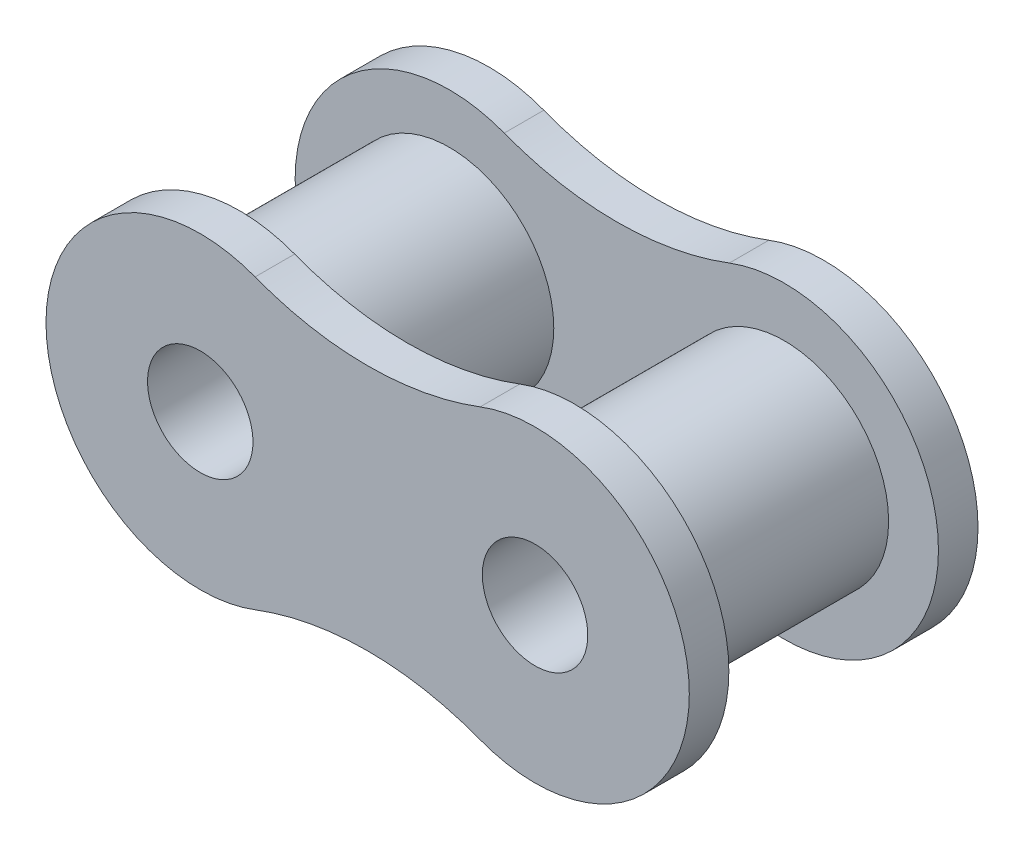
ISO-10303-21;
HEADER;
FILE_DESCRIPTION(('STEP AP214'),'2;1');
FILE_NAME('part.step','',(''),(''),'','','');
FILE_SCHEMA(('AUTOMOTIVE_DESIGN { 1 0 10303 214 1 1 1 1 }'));
ENDSEC;
DATA;
#1=APPLICATION_CONTEXT('core data for automotive mechanical design processes');
#2=APPLICATION_PROTOCOL_DEFINITION('international standard','automotive_design',2000,#1);
#3=PRODUCT_CONTEXT('',#1,'mechanical');
#4=PRODUCT('Part','Part','',(#3));
#5=PRODUCT_RELATED_PRODUCT_CATEGORY('part','',(#4));
#6=PRODUCT_DEFINITION_FORMATION('','',#4);
#7=PRODUCT_DEFINITION_CONTEXT('part definition',#1,'design');
#8=PRODUCT_DEFINITION('design','',#6,#7);
#9=PRODUCT_DEFINITION_SHAPE('','',#8);
#10=(LENGTH_UNIT() NAMED_UNIT(*) SI_UNIT(.MILLI.,.METRE.));
#11=(NAMED_UNIT(*) PLANE_ANGLE_UNIT() SI_UNIT($,.RADIAN.));
#12=(NAMED_UNIT(*) SI_UNIT($,.STERADIAN.) SOLID_ANGLE_UNIT());
#13=UNCERTAINTY_MEASURE_WITH_UNIT(LENGTH_MEASURE(1.E-05),#10,'distance_accuracy_value','');
#14=(GEOMETRIC_REPRESENTATION_CONTEXT(3) GLOBAL_UNCERTAINTY_ASSIGNED_CONTEXT((#13)) GLOBAL_UNIT_ASSIGNED_CONTEXT((#10,
#11,#12)) REPRESENTATION_CONTEXT('',''));
#15=CARTESIAN_POINT('',(0.,0.,0.));
#16=DIRECTION('',(0.,0.,1.));
#17=DIRECTION('',(1.,0.,0.));
#18=AXIS2_PLACEMENT_3D('',#15,#16,#17);
#19=CARTESIAN_POINT('',(6.35,16.6823259769134,1.5));
#20=DIRECTION('',(0.,0.,-1.));
#21=DIRECTION('',(-1.,0.,0.));
#22=AXIS2_PLACEMENT_3D('',#19,#20,#21);
#23=CYLINDRICAL_SURFACE('',#22,12.);
#24=CARTESIAN_POINT('',(6.35,16.6823259769134,0.));
#25=DIRECTION('',(0.,0.,-1.));
#26=DIRECTION('',(1.,0.,0.));
#27=AXIS2_PLACEMENT_3D('',#24,#25,#26);
#28=CIRCLE('',#27,12.);
#29=CARTESIAN_POINT('',(10.6189075630252,5.46731691680355,0.));
#30=VERTEX_POINT('',#29);
#31=CARTESIAN_POINT('',(2.08109243697479,5.46731691680355,0.));
#32=VERTEX_POINT('',#31);
#33=EDGE_CURVE('E158',#30,#32,#28,.T.);
#34=ORIENTED_EDGE('',*,*,#33,.T.);
#35=DIRECTION('',(0.,0.,-1.));
#36=VECTOR('',#35,1.);
#37=CARTESIAN_POINT('',(2.08109243697479,5.46731691680355,1.5));
#38=LINE('',#37,#36);
#39=CARTESIAN_POINT('',(2.08109243697479,5.46731691680355,1.5));
#40=VERTEX_POINT('',#39);
#41=EDGE_CURVE('E11',#40,#32,#38,.T.);
#42=ORIENTED_EDGE('',*,*,#41,.F.);
#43=CARTESIAN_POINT('',(6.35,16.6823259769134,1.5));
#44=DIRECTION('',(0.,0.,-1.));
#45=DIRECTION('',(1.,0.,0.));
#46=AXIS2_PLACEMENT_3D('',#43,#44,#45);
#47=CIRCLE('',#46,12.);
#48=CARTESIAN_POINT('',(10.6189075630252,5.46731691680355,1.5));
#49=VERTEX_POINT('',#48);
#50=EDGE_CURVE('E159',#49,#40,#47,.T.);
#51=ORIENTED_EDGE('',*,*,#50,.F.);
#52=DIRECTION('',(0.,0.,-1.));
#53=VECTOR('',#52,1.);
#54=CARTESIAN_POINT('',(10.6189075630252,5.46731691680355,1.5));
#55=LINE('',#54,#53);
#56=EDGE_CURVE('E165',#49,#30,#55,.T.);
#57=ORIENTED_EDGE('',*,*,#56,.T.);
#58=EDGE_LOOP('',(#34,#42,#51,#57));
#59=FACE_BOUND('',#58,.T.);
#60=ADVANCED_FACE('F32',(#59),#23,.F.);
#61=CARTESIAN_POINT('',(0.,0.,1.5));
#62=DIRECTION('',(0.,0.,-1.));
#63=DIRECTION('',(-1.,0.,0.));
#64=AXIS2_PLACEMENT_3D('',#61,#62,#63);
#65=CYLINDRICAL_SURFACE('',#64,5.85);
#66=CARTESIAN_POINT('',(0.,0.,0.));
#67=DIRECTION('',(0.,0.,1.));
#68=DIRECTION('',(1.,0.,0.));
#69=AXIS2_PLACEMENT_3D('',#66,#67,#68);
#70=CIRCLE('',#69,5.85);
#71=CARTESIAN_POINT('',(2.08109243697479,-5.46731691680355,0.));
#72=VERTEX_POINT('',#71);
#73=EDGE_CURVE('E168',#32,#72,#70,.T.);
#74=ORIENTED_EDGE('',*,*,#73,.T.);
#75=DIRECTION('',(0.,0.,-1.));
#76=VECTOR('',#75,1.);
#77=CARTESIAN_POINT('',(2.08109243697479,-5.46731691680355,1.5));
#78=LINE('',#77,#76);
#79=CARTESIAN_POINT('',(2.08109243697479,-5.46731691680355,1.5));
#80=VERTEX_POINT('',#79);
#81=EDGE_CURVE('E40',#80,#72,#78,.T.);
#82=ORIENTED_EDGE('',*,*,#81,.F.);
#83=CARTESIAN_POINT('',(0.,0.,1.5));
#84=DIRECTION('',(0.,0.,1.));
#85=DIRECTION('',(1.,0.,0.));
#86=AXIS2_PLACEMENT_3D('',#83,#84,#85);
#87=CIRCLE('',#86,5.85);
#88=EDGE_CURVE('E79',#40,#80,#87,.T.);
#89=ORIENTED_EDGE('',*,*,#88,.F.);
#90=ORIENTED_EDGE('',*,*,#41,.T.);
#91=EDGE_LOOP('',(#74,#82,#89,#90));
#92=FACE_BOUND('',#91,.T.);
#93=ADVANCED_FACE('F192',(#92),#65,.T.);
#94=CARTESIAN_POINT('',(6.35,-16.6823259769134,1.5));
#95=DIRECTION('',(0.,0.,-1.));
#96=DIRECTION('',(-1.,0.,0.));
#97=AXIS2_PLACEMENT_3D('',#94,#95,#96);
#98=CYLINDRICAL_SURFACE('',#97,12.);
#99=CARTESIAN_POINT('',(6.35,-16.6823259769134,0.));
#100=DIRECTION('',(0.,0.,-1.));
#101=DIRECTION('',(-1.,0.,0.));
#102=AXIS2_PLACEMENT_3D('',#99,#100,#101);
#103=CIRCLE('',#102,12.);
#104=CARTESIAN_POINT('',(10.6189075630252,-5.46731691680355,0.));
#105=VERTEX_POINT('',#104);
#106=EDGE_CURVE('E66',#72,#105,#103,.T.);
#107=ORIENTED_EDGE('',*,*,#106,.T.);
#108=DIRECTION('',(0.,0.,-1.));
#109=VECTOR('',#108,1.);
#110=CARTESIAN_POINT('',(10.6189075630252,-5.46731691680355,1.5));
#111=LINE('',#110,#109);
#112=CARTESIAN_POINT('',(10.6189075630252,-5.46731691680355,1.5));
#113=VERTEX_POINT('',#112);
#114=EDGE_CURVE('E173',#113,#105,#111,.T.);
#115=ORIENTED_EDGE('',*,*,#114,.F.);
#116=CARTESIAN_POINT('',(6.35,-16.6823259769134,1.5));
#117=DIRECTION('',(0.,0.,-1.));
#118=DIRECTION('',(-1.,0.,0.));
#119=AXIS2_PLACEMENT_3D('',#116,#117,#118);
#120=CIRCLE('',#119,12.);
#121=EDGE_CURVE('E162',#80,#113,#120,.T.);
#122=ORIENTED_EDGE('',*,*,#121,.F.);
#123=ORIENTED_EDGE('',*,*,#81,.T.);
#124=EDGE_LOOP('',(#107,#115,#122,#123));
#125=FACE_BOUND('',#124,.T.);
#126=ADVANCED_FACE('F175',(#125),#98,.F.);
#127=CARTESIAN_POINT('',(12.7,0.,1.5));
#128=DIRECTION('',(0.,0.,-1.));
#129=DIRECTION('',(-1.,0.,0.));
#130=AXIS2_PLACEMENT_3D('',#127,#128,#129);
#131=CYLINDRICAL_SURFACE('',#130,5.85);
#132=CARTESIAN_POINT('',(12.7,0.,0.));
#133=DIRECTION('',(0.,0.,1.));
#134=DIRECTION('',(1.,0.,0.));
#135=AXIS2_PLACEMENT_3D('',#132,#133,#134);
#136=CIRCLE('',#135,5.85);
#137=EDGE_CURVE('E72',#105,#30,#136,.T.);
#138=ORIENTED_EDGE('',*,*,#137,.T.);
#139=ORIENTED_EDGE('',*,*,#56,.F.);
#140=CARTESIAN_POINT('',(12.7,0.,1.5));
#141=DIRECTION('',(0.,0.,1.));
#142=DIRECTION('',(1.,0.,0.));
#143=AXIS2_PLACEMENT_3D('',#140,#141,#142);
#144=CIRCLE('',#143,5.85);
#145=EDGE_CURVE('E48',#113,#49,#144,.T.);
#146=ORIENTED_EDGE('',*,*,#145,.F.);
#147=ORIENTED_EDGE('',*,*,#114,.T.);
#148=EDGE_LOOP('',(#138,#139,#146,#147));
#149=FACE_BOUND('',#148,.T.);
#150=ADVANCED_FACE('F182',(#149),#131,.T.);
#151=CARTESIAN_POINT('',(9.525,8.3411629884567,1.5));
#152=DIRECTION('',(0.,0.,1.));
#153=DIRECTION('',(1.,0.,0.));
#154=AXIS2_PLACEMENT_3D('',#151,#152,#153);
#155=PLANE('',#154);
#156=CARTESIAN_POINT('',(12.7,0.,1.5));
#157=DIRECTION('',(0.,0.,1.));
#158=DIRECTION('',(1.,0.,0.));
#159=AXIS2_PLACEMENT_3D('',#156,#157,#158);
#160=CIRCLE('',#159,3.96);
#161=CARTESIAN_POINT('',(8.74,0.,1.5));
#162=VERTEX_POINT('',#161);
#163=EDGE_CURVE('E336',#162,#162,#160,.T.);
#164=ORIENTED_EDGE('',*,*,#163,.F.);
#165=EDGE_LOOP('',(#164));
#166=FACE_BOUND('',#165,.T.);
#167=CARTESIAN_POINT('',(0.,0.,1.5));
#168=DIRECTION('',(0.,0.,1.));
#169=DIRECTION('',(1.,0.,0.));
#170=AXIS2_PLACEMENT_3D('',#167,#168,#169);
#171=CIRCLE('',#170,3.96);
#172=CARTESIAN_POINT('',(-3.96,0.,1.5));
#173=VERTEX_POINT('',#172);
#174=EDGE_CURVE('E155',#173,#173,#171,.T.);
#175=ORIENTED_EDGE('',*,*,#174,.F.);
#176=EDGE_LOOP('',(#175));
#177=FACE_BOUND('',#176,.T.);
#178=ORIENTED_EDGE('',*,*,#50,.T.);
#179=ORIENTED_EDGE('',*,*,#88,.T.);
#180=ORIENTED_EDGE('',*,*,#121,.T.);
#181=ORIENTED_EDGE('',*,*,#145,.T.);
#182=EDGE_LOOP('',(#178,#179,#180,#181));
#183=FACE_BOUND('',#182,.T.);
#184=ADVANCED_FACE('F184',(#166,#177,#183),#155,.T.);
#185=CARTESIAN_POINT('',(9.525,8.3411629884567,0.));
#186=DIRECTION('',(0.,0.,1.));
#187=DIRECTION('',(1.,0.,0.));
#188=AXIS2_PLACEMENT_3D('',#185,#186,#187);
#189=PLANE('',#188);
#190=CARTESIAN_POINT('',(12.7,0.,0.));
#191=DIRECTION('',(0.,0.,-1.));
#192=DIRECTION('',(-1.,0.,0.));
#193=AXIS2_PLACEMENT_3D('',#190,#191,#192);
#194=CIRCLE('',#193,2.);
#195=CARTESIAN_POINT('',(10.7,0.,0.));
#196=VERTEX_POINT('',#195);
#197=EDGE_CURVE('E328',#196,#196,#194,.T.);
#198=ORIENTED_EDGE('',*,*,#197,.F.);
#199=EDGE_LOOP('',(#198));
#200=FACE_BOUND('',#199,.T.);
#201=CARTESIAN_POINT('',(0.,0.,0.));
#202=DIRECTION('',(0.,0.,-1.));
#203=DIRECTION('',(-1.,0.,0.));
#204=AXIS2_PLACEMENT_3D('',#201,#202,#203);
#205=CIRCLE('',#204,2.);
#206=CARTESIAN_POINT('',(-2.,0.,0.));
#207=VERTEX_POINT('',#206);
#208=EDGE_CURVE('E330',#207,#207,#205,.T.);
#209=ORIENTED_EDGE('',*,*,#208,.F.);
#210=EDGE_LOOP('',(#209));
#211=FACE_BOUND('',#210,.T.);
#212=ORIENTED_EDGE('',*,*,#33,.F.);
#213=ORIENTED_EDGE('',*,*,#137,.F.);
#214=ORIENTED_EDGE('',*,*,#106,.F.);
#215=ORIENTED_EDGE('',*,*,#73,.F.);
#216=EDGE_LOOP('',(#212,#213,#214,#215));
#217=FACE_BOUND('',#216,.T.);
#218=ADVANCED_FACE('F178',(#200,#211,#217),#189,.F.);
#219=CARTESIAN_POINT('',(0.,0.,20.6505714139949));
#220=DIRECTION('',(0.,0.,-1.));
#221=DIRECTION('',(-1.,0.,0.));
#222=AXIS2_PLACEMENT_3D('',#219,#220,#221);
#223=CYLINDRICAL_SURFACE('',#222,3.96);
#224=CARTESIAN_POINT('',(0.,0.,9.45));
#225=DIRECTION('',(0.,0.,-1.));
#226=DIRECTION('',(-1.,0.,0.));
#227=AXIS2_PLACEMENT_3D('',#224,#225,#226);
#228=CIRCLE('',#227,3.96);
#229=CARTESIAN_POINT('',(-3.96,0.,9.45));
#230=VERTEX_POINT('',#229);
#231=EDGE_CURVE('E126',#230,#230,#228,.T.);
#232=CARTESIAN_POINT('',(-3.96,0.,9.45));
#233=CARTESIAN_POINT('',(-3.96,0.,9.3671875));
#234=CARTESIAN_POINT('',(-3.96,0.,9.284375));
#235=CARTESIAN_POINT('',(-3.96,0.,9.11875));
#236=CARTESIAN_POINT('',(-3.96,0.,9.0359375));
#237=CARTESIAN_POINT('',(-3.96,0.,8.8703125));
#238=CARTESIAN_POINT('',(-3.96,0.,8.7875));
#239=CARTESIAN_POINT('',(-3.96,0.,8.621875));
#240=CARTESIAN_POINT('',(-3.96,0.,8.5390625));
#241=CARTESIAN_POINT('',(-3.96,0.,8.3734375));
#242=CARTESIAN_POINT('',(-3.96,0.,8.290625));
#243=CARTESIAN_POINT('',(-3.96,0.,8.125));
#244=CARTESIAN_POINT('',(-3.96,0.,8.0421875));
#245=CARTESIAN_POINT('',(-3.96,0.,7.8765625));
#246=CARTESIAN_POINT('',(-3.96,0.,7.79375));
#247=CARTESIAN_POINT('',(-3.96,0.,7.628125));
#248=CARTESIAN_POINT('',(-3.96,0.,7.5453125));
#249=CARTESIAN_POINT('',(-3.96,0.,7.3796875));
#250=CARTESIAN_POINT('',(-3.96,0.,7.296875));
#251=CARTESIAN_POINT('',(-3.96,0.,7.13125));
#252=CARTESIAN_POINT('',(-3.96,0.,7.0484375));
#253=CARTESIAN_POINT('',(-3.96,0.,6.8828125));
#254=CARTESIAN_POINT('',(-3.96,0.,6.8));
#255=CARTESIAN_POINT('',(-3.96,0.,6.634375));
#256=CARTESIAN_POINT('',(-3.96,0.,6.5515625));
#257=CARTESIAN_POINT('',(-3.96,0.,6.3859375));
#258=CARTESIAN_POINT('',(-3.96,0.,6.303125));
#259=CARTESIAN_POINT('',(-3.96,0.,6.1375));
#260=CARTESIAN_POINT('',(-3.96,0.,6.0546875));
#261=CARTESIAN_POINT('',(-3.96,0.,5.8890625));
#262=CARTESIAN_POINT('',(-3.96,0.,5.80625));
#263=CARTESIAN_POINT('',(-3.96,0.,5.640625));
#264=CARTESIAN_POINT('',(-3.96,0.,5.5578125));
#265=CARTESIAN_POINT('',(-3.96,0.,5.3921875));
#266=CARTESIAN_POINT('',(-3.96,0.,5.309375));
#267=CARTESIAN_POINT('',(-3.96,0.,5.14375));
#268=CARTESIAN_POINT('',(-3.96,0.,5.0609375));
#269=CARTESIAN_POINT('',(-3.96,0.,4.8953125));
#270=CARTESIAN_POINT('',(-3.96,0.,4.8125));
#271=CARTESIAN_POINT('',(-3.96,0.,4.646875));
#272=CARTESIAN_POINT('',(-3.96,0.,4.5640625));
#273=CARTESIAN_POINT('',(-3.96,0.,4.3984375));
#274=CARTESIAN_POINT('',(-3.96,0.,4.315625));
#275=CARTESIAN_POINT('',(-3.96,0.,4.15));
#276=CARTESIAN_POINT('',(-3.96,0.,4.0671875));
#277=CARTESIAN_POINT('',(-3.96,0.,3.9015625));
#278=CARTESIAN_POINT('',(-3.96,0.,3.81875));
#279=CARTESIAN_POINT('',(-3.96,0.,3.653125));
#280=CARTESIAN_POINT('',(-3.96,0.,3.5703125));
#281=CARTESIAN_POINT('',(-3.96,0.,3.4046875));
#282=CARTESIAN_POINT('',(-3.96,0.,3.321875));
#283=CARTESIAN_POINT('',(-3.96,0.,3.15625));
#284=CARTESIAN_POINT('',(-3.96,0.,3.0734375));
#285=CARTESIAN_POINT('',(-3.96,0.,2.9078125));
#286=CARTESIAN_POINT('',(-3.96,0.,2.825));
#287=CARTESIAN_POINT('',(-3.96,0.,2.659375));
#288=CARTESIAN_POINT('',(-3.96,0.,2.5765625));
#289=CARTESIAN_POINT('',(-3.96,0.,2.4109375));
#290=CARTESIAN_POINT('',(-3.96,0.,2.328125));
#291=CARTESIAN_POINT('',(-3.96,0.,2.1625));
#292=CARTESIAN_POINT('',(-3.96,0.,2.0796875));
#293=CARTESIAN_POINT('',(-3.96,0.,1.9140625));
#294=CARTESIAN_POINT('',(-3.96,0.,1.83125));
#295=CARTESIAN_POINT('',(-3.96,0.,1.665625));
#296=CARTESIAN_POINT('',(-3.96,0.,1.5828125));
#297=CARTESIAN_POINT('',(-3.96,0.,1.5));
#298=B_SPLINE_CURVE_WITH_KNOTS('',3,(#232,#233,#234,#235,#236,#237,#238,#239,#240,#241,#242,
#243,#244,#245,#246,#247,#248,#249,#250,#251,#252,#253,#254,#255,#256,#257,#258,#259,#260,#261,
#262,#263,#264,#265,#266,#267,#268,#269,#270,#271,#272,#273,#274,#275,#276,#277,#278,#279,#280,
#281,#282,#283,#284,#285,#286,#287,#288,#289,#290,#291,#292,#293,#294,#295,#296,#297),
.UNSPECIFIED.,.F.,.F.,(4,2,2,2,2,2,2,2,2,2,2,2,2,2,2,2,2,2,2,2,2,2,2,2,2,2,2,2,2,2,2,2,4),(0.,
0.2484375,0.496875000000001,0.745312499999999,0.99375,1.2421875,1.490625,1.7390625,1.9875,
2.2359375,2.484375,2.7328125,2.98125,3.2296875,3.478125,3.7265625,3.975,4.2234375,4.471875,
4.7203125,4.96875,5.2171875,5.465625,5.7140625,5.9625,6.2109375,6.459375,6.7078125,6.95625,
7.2046875,7.453125,7.7015625,7.95),.UNSPECIFIED.);
#299=EDGE_CURVE('BSEAM222',#230,#173,#298,.T.);
#300=ORIENTED_EDGE('',*,*,#231,.T.);
#301=ORIENTED_EDGE('',*,*,#174,.T.);
#302=ORIENTED_EDGE('',*,*,#299,.T.);
#303=ORIENTED_EDGE('',*,*,#299,.F.);
#304=EDGE_LOOP('',(#300,#302,#301,#303));
#305=FACE_BOUND('',#304,.T.);
#306=ADVANCED_FACE('F222',(#305),#223,.T.);
#307=CARTESIAN_POINT('',(6.35,16.6823259769134,9.45));
#308=DIRECTION('',(0.,0.,1.));
#309=DIRECTION('',(-1.,0.,0.));
#310=AXIS2_PLACEMENT_3D('',#307,#308,#309);
#311=CYLINDRICAL_SURFACE('',#310,12.);
#312=CARTESIAN_POINT('',(6.35,16.6823259769134,10.95));
#313=DIRECTION('',(0.,0.,-1.));
#314=DIRECTION('',(1.,0.,0.));
#315=AXIS2_PLACEMENT_3D('',#312,#313,#314);
#316=CIRCLE('',#315,12.);
#317=CARTESIAN_POINT('',(10.6189075630252,5.46731691680355,10.95));
#318=VERTEX_POINT('',#317);
#319=CARTESIAN_POINT('',(2.08109243697479,5.46731691680355,10.95));
#320=VERTEX_POINT('',#319);
#321=EDGE_CURVE('E143',#318,#320,#316,.T.);
#322=ORIENTED_EDGE('',*,*,#321,.F.);
#323=DIRECTION('',(0.,0.,1.));
#324=VECTOR('',#323,1.);
#325=CARTESIAN_POINT('',(10.6189075630252,5.46731691680355,9.45));
#326=LINE('',#325,#324);
#327=CARTESIAN_POINT('',(10.6189075630252,5.46731691680355,9.45));
#328=VERTEX_POINT('',#327);
#329=EDGE_CURVE('E131',#328,#318,#326,.T.);
#330=ORIENTED_EDGE('',*,*,#329,.F.);
#331=CARTESIAN_POINT('',(6.35,16.6823259769134,9.45));
#332=DIRECTION('',(0.,0.,-1.));
#333=DIRECTION('',(1.,0.,0.));
#334=AXIS2_PLACEMENT_3D('',#331,#332,#333);
#335=CIRCLE('',#334,12.);
#336=CARTESIAN_POINT('',(2.08109243697479,5.46731691680355,9.45));
#337=VERTEX_POINT('',#336);
#338=EDGE_CURVE('E110',#328,#337,#335,.T.);
#339=ORIENTED_EDGE('',*,*,#338,.T.);
#340=DIRECTION('',(0.,0.,1.));
#341=VECTOR('',#340,1.);
#342=CARTESIAN_POINT('',(2.08109243697479,5.46731691680355,9.45));
#343=LINE('',#342,#341);
#344=EDGE_CURVE('E119',#337,#320,#343,.T.);
#345=ORIENTED_EDGE('',*,*,#344,.T.);
#346=EDGE_LOOP('',(#322,#330,#339,#345));
#347=FACE_BOUND('',#346,.T.);
#348=ADVANCED_FACE('F129',(#347),#311,.F.);
#349=CARTESIAN_POINT('',(0.,0.,9.45));
#350=DIRECTION('',(0.,0.,1.));
#351=DIRECTION('',(-1.,0.,0.));
#352=AXIS2_PLACEMENT_3D('',#349,#350,#351);
#353=CYLINDRICAL_SURFACE('',#352,5.85);
#354=CARTESIAN_POINT('',(0.,0.,10.95));
#355=DIRECTION('',(0.,0.,1.));
#356=DIRECTION('',(1.,0.,0.));
#357=AXIS2_PLACEMENT_3D('',#354,#355,#356);
#358=CIRCLE('',#357,5.85);
#359=CARTESIAN_POINT('',(2.08109243697479,-5.46731691680355,10.95));
#360=VERTEX_POINT('',#359);
#361=EDGE_CURVE('E122',#320,#360,#358,.T.);
#362=ORIENTED_EDGE('',*,*,#361,.F.);
#363=ORIENTED_EDGE('',*,*,#344,.F.);
#364=CARTESIAN_POINT('',(0.,0.,9.45));
#365=DIRECTION('',(0.,0.,1.));
#366=DIRECTION('',(1.,0.,0.));
#367=AXIS2_PLACEMENT_3D('',#364,#365,#366);
#368=CIRCLE('',#367,5.85);
#369=CARTESIAN_POINT('',(2.08109243697479,-5.46731691680355,9.45));
#370=VERTEX_POINT('',#369);
#371=EDGE_CURVE('E106',#337,#370,#368,.T.);
#372=ORIENTED_EDGE('',*,*,#371,.T.);
#373=DIRECTION('',(0.,0.,1.));
#374=VECTOR('',#373,1.);
#375=CARTESIAN_POINT('',(2.08109243697479,-5.46731691680355,9.45));
#376=LINE('',#375,#374);
#377=EDGE_CURVE('E127',#370,#360,#376,.T.);
#378=ORIENTED_EDGE('',*,*,#377,.T.);
#379=EDGE_LOOP('',(#362,#363,#372,#378));
#380=FACE_BOUND('',#379,.T.);
#381=ADVANCED_FACE('F120',(#380),#353,.T.);
#382=CARTESIAN_POINT('',(6.35,-16.6823259769134,9.45));
#383=DIRECTION('',(0.,0.,1.));
#384=DIRECTION('',(-1.,0.,0.));
#385=AXIS2_PLACEMENT_3D('',#382,#383,#384);
#386=CYLINDRICAL_SURFACE('',#385,12.);
#387=CARTESIAN_POINT('',(6.35,-16.6823259769134,10.95));
#388=DIRECTION('',(0.,0.,-1.));
#389=DIRECTION('',(-1.,0.,0.));
#390=AXIS2_PLACEMENT_3D('',#387,#388,#389);
#391=CIRCLE('',#390,12.);
#392=CARTESIAN_POINT('',(10.6189075630252,-5.46731691680355,10.95));
#393=VERTEX_POINT('',#392);
#394=EDGE_CURVE('E134',#360,#393,#391,.T.);
#395=ORIENTED_EDGE('',*,*,#394,.F.);
#396=ORIENTED_EDGE('',*,*,#377,.F.);
#397=CARTESIAN_POINT('',(6.35,-16.6823259769134,9.45));
#398=DIRECTION('',(0.,0.,-1.));
#399=DIRECTION('',(-1.,0.,0.));
#400=AXIS2_PLACEMENT_3D('',#397,#398,#399);
#401=CIRCLE('',#400,12.);
#402=CARTESIAN_POINT('',(10.6189075630252,-5.46731691680355,9.45));
#403=VERTEX_POINT('',#402);
#404=EDGE_CURVE('E113',#370,#403,#401,.T.);
#405=ORIENTED_EDGE('',*,*,#404,.T.);
#406=DIRECTION('',(0.,0.,1.));
#407=VECTOR('',#406,1.);
#408=CARTESIAN_POINT('',(10.6189075630252,-5.46731691680355,9.45));
#409=LINE('',#408,#407);
#410=EDGE_CURVE('E149',#403,#393,#409,.T.);
#411=ORIENTED_EDGE('',*,*,#410,.T.);
#412=EDGE_LOOP('',(#395,#396,#405,#411));
#413=FACE_BOUND('',#412,.T.);
#414=ADVANCED_FACE('F246',(#413),#386,.F.);
#415=CARTESIAN_POINT('',(12.7,0.,9.45));
#416=DIRECTION('',(0.,0.,1.));
#417=DIRECTION('',(-1.,0.,0.));
#418=AXIS2_PLACEMENT_3D('',#415,#416,#417);
#419=CYLINDRICAL_SURFACE('',#418,5.85);
#420=CARTESIAN_POINT('',(12.7,0.,10.95));
#421=DIRECTION('',(0.,0.,1.));
#422=DIRECTION('',(1.,0.,0.));
#423=AXIS2_PLACEMENT_3D('',#420,#421,#422);
#424=CIRCLE('',#423,5.85);
#425=EDGE_CURVE('E132',#393,#318,#424,.T.);
#426=ORIENTED_EDGE('',*,*,#425,.F.);
#427=ORIENTED_EDGE('',*,*,#410,.F.);
#428=CARTESIAN_POINT('',(12.7,0.,9.45));
#429=DIRECTION('',(0.,0.,1.));
#430=DIRECTION('',(1.,0.,0.));
#431=AXIS2_PLACEMENT_3D('',#428,#429,#430);
#432=CIRCLE('',#431,5.85);
#433=EDGE_CURVE('E141',#403,#328,#432,.T.);
#434=ORIENTED_EDGE('',*,*,#433,.T.);
#435=ORIENTED_EDGE('',*,*,#329,.T.);
#436=EDGE_LOOP('',(#426,#427,#434,#435));
#437=FACE_BOUND('',#436,.T.);
#438=ADVANCED_FACE('F255',(#437),#419,.T.);
#439=CARTESIAN_POINT('',(9.525,8.3411629884567,9.45));
#440=DIRECTION('',(0.,0.,-1.));
#441=DIRECTION('',(1.,0.,0.));
#442=AXIS2_PLACEMENT_3D('',#439,#440,#441);
#443=PLANE('',#442);
#444=CARTESIAN_POINT('',(12.7,0.,9.45));
#445=DIRECTION('',(0.,0.,-1.));
#446=DIRECTION('',(-1.,0.,0.));
#447=AXIS2_PLACEMENT_3D('',#444,#445,#446);
#448=CIRCLE('',#447,3.96);
#449=CARTESIAN_POINT('',(8.74,0.,9.45));
#450=VERTEX_POINT('',#449);
#451=EDGE_CURVE('E137',#450,#450,#448,.T.);
#452=ORIENTED_EDGE('',*,*,#451,.F.);
#453=EDGE_LOOP('',(#452));
#454=FACE_BOUND('',#453,.T.);
#455=ORIENTED_EDGE('',*,*,#231,.F.);
#456=EDGE_LOOP('',(#455));
#457=FACE_BOUND('',#456,.T.);
#458=ORIENTED_EDGE('',*,*,#338,.F.);
#459=ORIENTED_EDGE('',*,*,#433,.F.);
#460=ORIENTED_EDGE('',*,*,#404,.F.);
#461=ORIENTED_EDGE('',*,*,#371,.F.);
#462=EDGE_LOOP('',(#458,#459,#460,#461));
#463=FACE_BOUND('',#462,.T.);
#464=ADVANCED_FACE('F108',(#454,#457,#463),#443,.T.);
#465=CARTESIAN_POINT('',(9.525,8.3411629884567,10.95));
#466=DIRECTION('',(0.,0.,-1.));
#467=DIRECTION('',(1.,0.,0.));
#468=AXIS2_PLACEMENT_3D('',#465,#466,#467);
#469=PLANE('',#468);
#470=CARTESIAN_POINT('',(12.7,0.,10.95));
#471=DIRECTION('',(0.,0.,-1.));
#472=DIRECTION('',(-1.,0.,0.));
#473=AXIS2_PLACEMENT_3D('',#470,#471,#472);
#474=CIRCLE('',#473,2.);
#475=CARTESIAN_POINT('',(10.7,0.,10.95));
#476=VERTEX_POINT('',#475);
#477=EDGE_CURVE('E325',#476,#476,#474,.T.);
#478=ORIENTED_EDGE('',*,*,#477,.T.);
#479=EDGE_LOOP('',(#478));
#480=FACE_BOUND('',#479,.T.);
#481=CARTESIAN_POINT('',(0.,0.,10.95));
#482=DIRECTION('',(0.,0.,-1.));
#483=DIRECTION('',(-1.,0.,0.));
#484=AXIS2_PLACEMENT_3D('',#481,#482,#483);
#485=CIRCLE('',#484,2.);
#486=CARTESIAN_POINT('',(-2.,0.,10.95));
#487=VERTEX_POINT('',#486);
#488=EDGE_CURVE('E333',#487,#487,#485,.T.);
#489=ORIENTED_EDGE('',*,*,#488,.T.);
#490=EDGE_LOOP('',(#489));
#491=FACE_BOUND('',#490,.T.);
#492=ORIENTED_EDGE('',*,*,#321,.T.);
#493=ORIENTED_EDGE('',*,*,#361,.T.);
#494=ORIENTED_EDGE('',*,*,#394,.T.);
#495=ORIENTED_EDGE('',*,*,#425,.T.);
#496=EDGE_LOOP('',(#492,#493,#494,#495));
#497=FACE_BOUND('',#496,.T.);
#498=ADVANCED_FACE('F274',(#480,#491,#497),#469,.F.);
#499=CARTESIAN_POINT('',(12.7,0.,20.6505714139949));
#500=DIRECTION('',(0.,0.,-1.));
#501=DIRECTION('',(-1.,0.,0.));
#502=AXIS2_PLACEMENT_3D('',#499,#500,#501);
#503=CYLINDRICAL_SURFACE('',#502,3.96);
#504=CARTESIAN_POINT('',(8.74,0.,9.45));
#505=CARTESIAN_POINT('',(8.74,0.,9.3671875));
#506=CARTESIAN_POINT('',(8.74,0.,9.284375));
#507=CARTESIAN_POINT('',(8.74,0.,9.11875));
#508=CARTESIAN_POINT('',(8.74,0.,9.0359375));
#509=CARTESIAN_POINT('',(8.74,0.,8.8703125));
#510=CARTESIAN_POINT('',(8.74,0.,8.7875));
#511=CARTESIAN_POINT('',(8.74,0.,8.621875));
#512=CARTESIAN_POINT('',(8.74,0.,8.5390625));
#513=CARTESIAN_POINT('',(8.74,0.,8.3734375));
#514=CARTESIAN_POINT('',(8.74,0.,8.290625));
#515=CARTESIAN_POINT('',(8.74,0.,8.125));
#516=CARTESIAN_POINT('',(8.74,0.,8.0421875));
#517=CARTESIAN_POINT('',(8.74,0.,7.8765625));
#518=CARTESIAN_POINT('',(8.74,0.,7.79375));
#519=CARTESIAN_POINT('',(8.74,0.,7.628125));
#520=CARTESIAN_POINT('',(8.74,0.,7.5453125));
#521=CARTESIAN_POINT('',(8.74,0.,7.3796875));
#522=CARTESIAN_POINT('',(8.74,0.,7.296875));
#523=CARTESIAN_POINT('',(8.74,0.,7.13125));
#524=CARTESIAN_POINT('',(8.74,0.,7.0484375));
#525=CARTESIAN_POINT('',(8.74,0.,6.8828125));
#526=CARTESIAN_POINT('',(8.74,0.,6.8));
#527=CARTESIAN_POINT('',(8.74,0.,6.634375));
#528=CARTESIAN_POINT('',(8.74,0.,6.5515625));
#529=CARTESIAN_POINT('',(8.74,0.,6.3859375));
#530=CARTESIAN_POINT('',(8.74,0.,6.303125));
#531=CARTESIAN_POINT('',(8.74,0.,6.1375));
#532=CARTESIAN_POINT('',(8.74,0.,6.0546875));
#533=CARTESIAN_POINT('',(8.74,0.,5.8890625));
#534=CARTESIAN_POINT('',(8.74,0.,5.80625));
#535=CARTESIAN_POINT('',(8.74,0.,5.640625));
#536=CARTESIAN_POINT('',(8.74,0.,5.5578125));
#537=CARTESIAN_POINT('',(8.74,0.,5.3921875));
#538=CARTESIAN_POINT('',(8.74,0.,5.309375));
#539=CARTESIAN_POINT('',(8.74,0.,5.14375));
#540=CARTESIAN_POINT('',(8.74,0.,5.0609375));
#541=CARTESIAN_POINT('',(8.74,0.,4.8953125));
#542=CARTESIAN_POINT('',(8.74,0.,4.8125));
#543=CARTESIAN_POINT('',(8.74,0.,4.646875));
#544=CARTESIAN_POINT('',(8.74,0.,4.5640625));
#545=CARTESIAN_POINT('',(8.74,0.,4.3984375));
#546=CARTESIAN_POINT('',(8.74,0.,4.315625));
#547=CARTESIAN_POINT('',(8.74,0.,4.15));
#548=CARTESIAN_POINT('',(8.74,0.,4.0671875));
#549=CARTESIAN_POINT('',(8.74,0.,3.9015625));
#550=CARTESIAN_POINT('',(8.74,0.,3.81875));
#551=CARTESIAN_POINT('',(8.74,0.,3.653125));
#552=CARTESIAN_POINT('',(8.74,0.,3.5703125));
#553=CARTESIAN_POINT('',(8.74,0.,3.4046875));
#554=CARTESIAN_POINT('',(8.74,0.,3.321875));
#555=CARTESIAN_POINT('',(8.74,0.,3.15625));
#556=CARTESIAN_POINT('',(8.74,0.,3.0734375));
#557=CARTESIAN_POINT('',(8.74,0.,2.9078125));
#558=CARTESIAN_POINT('',(8.74,0.,2.825));
#559=CARTESIAN_POINT('',(8.74,0.,2.659375));
#560=CARTESIAN_POINT('',(8.74,0.,2.5765625));
#561=CARTESIAN_POINT('',(8.74,0.,2.4109375));
#562=CARTESIAN_POINT('',(8.74,0.,2.328125));
#563=CARTESIAN_POINT('',(8.74,0.,2.1625));
#564=CARTESIAN_POINT('',(8.74,0.,2.0796875));
#565=CARTESIAN_POINT('',(8.74,0.,1.9140625));
#566=CARTESIAN_POINT('',(8.74,0.,1.83125));
#567=CARTESIAN_POINT('',(8.74,0.,1.665625));
#568=CARTESIAN_POINT('',(8.74,0.,1.5828125));
#569=CARTESIAN_POINT('',(8.74,0.,1.5));
#570=B_SPLINE_CURVE_WITH_KNOTS('',3,(#504,#505,#506,#507,#508,#509,#510,#511,#512,#513,#514,
#515,#516,#517,#518,#519,#520,#521,#522,#523,#524,#525,#526,#527,#528,#529,#530,#531,#532,#533,
#534,#535,#536,#537,#538,#539,#540,#541,#542,#543,#544,#545,#546,#547,#548,#549,#550,#551,#552,
#553,#554,#555,#556,#557,#558,#559,#560,#561,#562,#563,#564,#565,#566,#567,#568,#569),
.UNSPECIFIED.,.F.,.F.,(4,2,2,2,2,2,2,2,2,2,2,2,2,2,2,2,2,2,2,2,2,2,2,2,2,2,2,2,2,2,2,2,4),(0.,
0.2484375,0.496875000000001,0.745312499999999,0.99375,1.2421875,1.490625,1.7390625,1.9875,
2.2359375,2.484375,2.7328125,2.98125,3.2296875,3.478125,3.7265625,3.975,4.2234375,4.471875,
4.7203125,4.96875,5.2171875,5.465625,5.7140625,5.9625,6.2109375,6.459375,6.7078125,6.95625,
7.2046875,7.453125,7.7015625,7.95),.UNSPECIFIED.);
#571=EDGE_CURVE('BSEAM281',#450,#162,#570,.T.);
#572=ORIENTED_EDGE('',*,*,#451,.T.);
#573=ORIENTED_EDGE('',*,*,#163,.T.);
#574=ORIENTED_EDGE('',*,*,#571,.T.);
#575=ORIENTED_EDGE('',*,*,#571,.F.);
#576=EDGE_LOOP('',(#572,#574,#573,#575));
#577=FACE_BOUND('',#576,.T.);
#578=ADVANCED_FACE('F281',(#577),#503,.T.);
#579=CARTESIAN_POINT('',(0.,0.,10.95));
#580=DIRECTION('',(0.,0.,-1.));
#581=DIRECTION('',(-1.,0.,0.));
#582=AXIS2_PLACEMENT_3D('',#579,#580,#581);
#583=CYLINDRICAL_SURFACE('',#582,2.);
#584=ORIENTED_EDGE('',*,*,#488,.F.);
#585=EDGE_LOOP('',(#584));
#586=FACE_BOUND('',#585,.T.);
#587=ORIENTED_EDGE('',*,*,#208,.T.);
#588=EDGE_LOOP('',(#587));
#589=FACE_BOUND('',#588,.T.);
#590=ADVANCED_FACE('F285',(#586,#589),#583,.F.);
#591=CARTESIAN_POINT('',(12.7,0.,10.95));
#592=DIRECTION('',(0.,0.,-1.));
#593=DIRECTION('',(-1.,0.,0.));
#594=AXIS2_PLACEMENT_3D('',#591,#592,#593);
#595=CYLINDRICAL_SURFACE('',#594,2.);
#596=ORIENTED_EDGE('',*,*,#477,.F.);
#597=EDGE_LOOP('',(#596));
#598=FACE_BOUND('',#597,.T.);
#599=ORIENTED_EDGE('',*,*,#197,.T.);
#600=EDGE_LOOP('',(#599));
#601=FACE_BOUND('',#600,.T.);
#602=ADVANCED_FACE('F308',(#598,#601),#595,.F.);
#603=CLOSED_SHELL('',(#60,#93,#126,#150,#184,#218,#306,#348,#381,#414,#438,#464,#498,#578,#590,#602));
#604=MANIFOLD_SOLID_BREP('B2',#603);
#605=ADVANCED_BREP_SHAPE_REPRESENTATION('',(#18,#604),#14);
#606=SHAPE_DEFINITION_REPRESENTATION(#9,#605);
ENDSEC;
END-ISO-10303-21;
